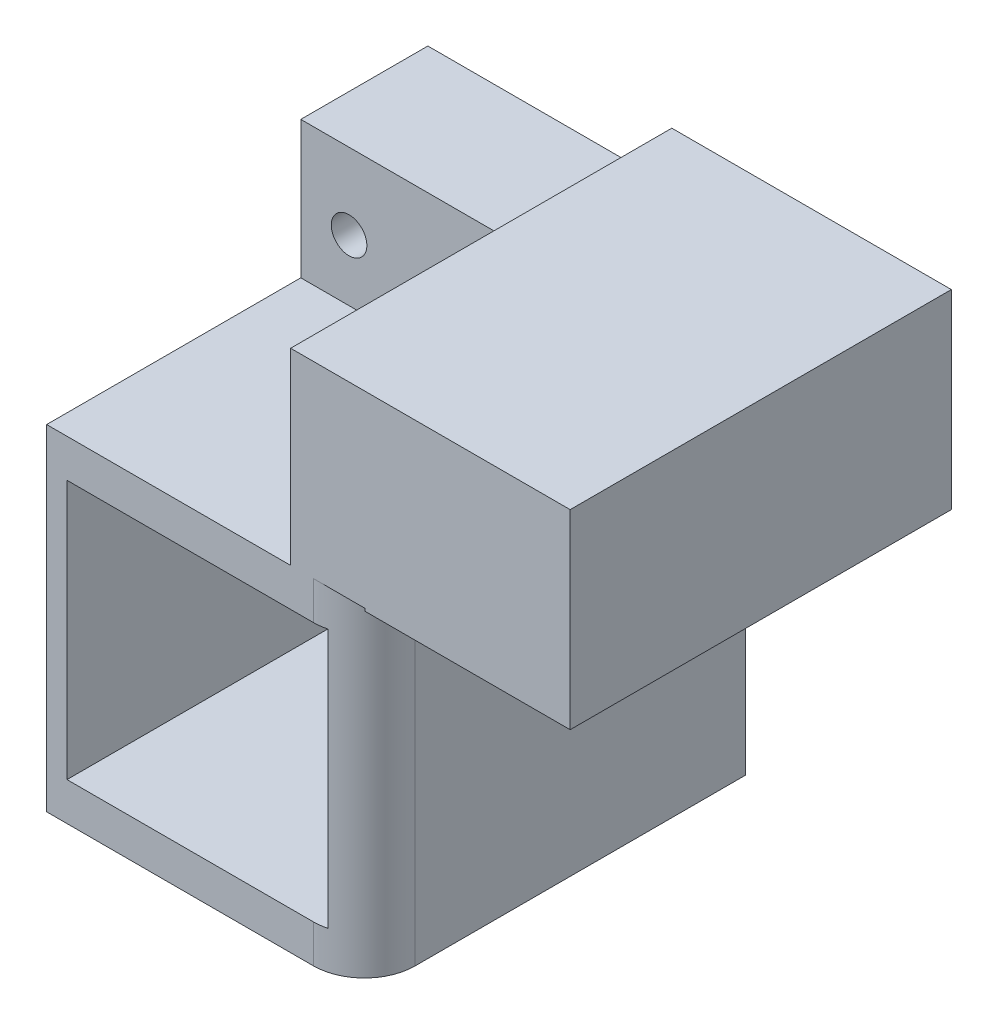
ISO-10303-21;
HEADER;
FILE_DESCRIPTION(('STEP AP214'),'2;1');
FILE_NAME('part.step','',(''),(''),'','','');
FILE_SCHEMA(('AUTOMOTIVE_DESIGN { 1 0 10303 214 1 1 1 1 }'));
ENDSEC;
DATA;
#1=APPLICATION_CONTEXT('core data for automotive mechanical design processes');
#2=APPLICATION_PROTOCOL_DEFINITION('international standard','automotive_design',2000,#1);
#3=PRODUCT_CONTEXT('',#1,'mechanical');
#4=PRODUCT('Part','Part','',(#3));
#5=PRODUCT_RELATED_PRODUCT_CATEGORY('part','',(#4));
#6=PRODUCT_DEFINITION_FORMATION('','',#4);
#7=PRODUCT_DEFINITION_CONTEXT('part definition',#1,'design');
#8=PRODUCT_DEFINITION('design','',#6,#7);
#9=PRODUCT_DEFINITION_SHAPE('','',#8);
#10=(LENGTH_UNIT() NAMED_UNIT(*) SI_UNIT(.MILLI.,.METRE.));
#11=(NAMED_UNIT(*) PLANE_ANGLE_UNIT() SI_UNIT($,.RADIAN.));
#12=(NAMED_UNIT(*) SI_UNIT($,.STERADIAN.) SOLID_ANGLE_UNIT());
#13=UNCERTAINTY_MEASURE_WITH_UNIT(LENGTH_MEASURE(1.E-05),#10,'distance_accuracy_value','');
#14=(GEOMETRIC_REPRESENTATION_CONTEXT(3) GLOBAL_UNCERTAINTY_ASSIGNED_CONTEXT((#13)) GLOBAL_UNIT_ASSIGNED_CONTEXT((#10,
#11,#12)) REPRESENTATION_CONTEXT('',''));
#15=CARTESIAN_POINT('',(0.,0.,0.));
#16=DIRECTION('',(0.,0.,1.));
#17=DIRECTION('',(1.,0.,0.));
#18=AXIS2_PLACEMENT_3D('',#15,#16,#17);
#19=CARTESIAN_POINT('',(-207.4,-33.8,81.));
#20=DIRECTION('',(0.,0.,1.));
#21=DIRECTION('',(1.,0.,0.));
#22=AXIS2_PLACEMENT_3D('',#19,#20,#21);
#23=PLANE('',#22);
#24=DIRECTION('',(0.,-1.,0.));
#25=VECTOR('',#24,1.);
#26=CARTESIAN_POINT('',(-207.4,-33.8,81.));
#27=LINE('',#26,#25);
#28=CARTESIAN_POINT('',(-207.4,-33.8,81.));
#29=VERTEX_POINT('',#28);
#30=CARTESIAN_POINT('',(-207.4,-37.8,81.));
#31=VERTEX_POINT('',#30);
#32=EDGE_CURVE('E504',#29,#31,#27,.T.);
#33=ORIENTED_EDGE('',*,*,#32,.F.);
#34=DIRECTION('',(1.,0.,0.));
#35=VECTOR('',#34,1.);
#36=CARTESIAN_POINT('',(-207.4,-33.8,81.));
#37=LINE('',#36,#35);
#38=CARTESIAN_POINT('',(-197.4,-33.8,81.));
#39=VERTEX_POINT('',#38);
#40=EDGE_CURVE('E429',#29,#39,#37,.T.);
#41=ORIENTED_EDGE('',*,*,#40,.T.);
#42=DIRECTION('',(0.,-1.,0.));
#43=VECTOR('',#42,1.);
#44=CARTESIAN_POINT('',(-197.4,-33.8,81.));
#45=LINE('',#44,#43);
#46=CARTESIAN_POINT('',(-197.4,-37.8,81.));
#47=VERTEX_POINT('',#46);
#48=EDGE_CURVE('E101',#39,#47,#45,.T.);
#49=ORIENTED_EDGE('',*,*,#48,.T.);
#50=DIRECTION('',(1.,0.,0.));
#51=VECTOR('',#50,1.);
#52=CARTESIAN_POINT('',(-210.,-37.8,81.));
#53=LINE('',#52,#51);
#54=EDGE_CURVE('E388',#31,#47,#53,.T.);
#55=ORIENTED_EDGE('',*,*,#54,.F.);
#56=EDGE_LOOP('',(#33,#41,#49,#55));
#57=FACE_BOUND('',#56,.T.);
#58=ADVANCED_FACE('F14',(#57),#23,.F.);
#59=CARTESIAN_POINT('',(-194.4,-30.,73.49));
#60=DIRECTION('',(0.,0.,1.));
#61=DIRECTION('',(1.,0.,0.));
#62=AXIS2_PLACEMENT_3D('',#59,#60,#61);
#63=PLANE('',#62);
#64=CARTESIAN_POINT('',(-194.4,-30.,73.49));
#65=DIRECTION('',(0.,0.,-1.));
#66=DIRECTION('',(1.,0.,0.));
#67=AXIS2_PLACEMENT_3D('',#64,#65,#66);
#68=CIRCLE('',#67,1.4);
#69=CARTESIAN_POINT('',(-193.,-30.,73.49));
#70=VERTEX_POINT('',#69);
#71=EDGE_CURVE('E482',#70,#70,#68,.T.);
#72=ORIENTED_EDGE('',*,*,#71,.F.);
#73=EDGE_LOOP('',(#72));
#74=FACE_BOUND('',#73,.T.);
#75=CARTESIAN_POINT('',(-194.4,-30.,73.49));
#76=DIRECTION('',(0.,0.,-1.));
#77=DIRECTION('',(1.,0.,0.));
#78=AXIS2_PLACEMENT_3D('',#75,#76,#77);
#79=CIRCLE('',#78,1.9);
#80=CARTESIAN_POINT('',(-192.5,-30.,73.49));
#81=VERTEX_POINT('',#80);
#82=EDGE_CURVE('E421',#81,#81,#79,.T.);
#83=ORIENTED_EDGE('',*,*,#82,.T.);
#84=EDGE_LOOP('',(#83));
#85=FACE_BOUND('',#84,.T.);
#86=ADVANCED_FACE('F914',(#74,#85),#63,.F.);
#87=CARTESIAN_POINT('',(-210.4,-30.,73.49));
#88=DIRECTION('',(0.,0.,1.));
#89=DIRECTION('',(1.,0.,0.));
#90=AXIS2_PLACEMENT_3D('',#87,#88,#89);
#91=PLANE('',#90);
#92=CARTESIAN_POINT('',(-210.4,-30.,73.49));
#93=DIRECTION('',(0.,0.,-1.));
#94=DIRECTION('',(1.,0.,0.));
#95=AXIS2_PLACEMENT_3D('',#92,#93,#94);
#96=CIRCLE('',#95,1.4);
#97=CARTESIAN_POINT('',(-209.,-30.,73.49));
#98=VERTEX_POINT('',#97);
#99=EDGE_CURVE('E25',#98,#98,#96,.T.);
#100=ORIENTED_EDGE('',*,*,#99,.F.);
#101=EDGE_LOOP('',(#100));
#102=FACE_BOUND('',#101,.T.);
#103=CARTESIAN_POINT('',(-210.4,-30.,73.49));
#104=DIRECTION('',(0.,0.,-1.));
#105=DIRECTION('',(1.,0.,0.));
#106=AXIS2_PLACEMENT_3D('',#103,#104,#105);
#107=CIRCLE('',#106,1.9);
#108=CARTESIAN_POINT('',(-208.5,-30.,73.49));
#109=VERTEX_POINT('',#108);
#110=EDGE_CURVE('E452',#109,#109,#107,.T.);
#111=ORIENTED_EDGE('',*,*,#110,.T.);
#112=EDGE_LOOP('',(#111));
#113=FACE_BOUND('',#112,.T.);
#114=ADVANCED_FACE('F819',(#102,#113),#91,.F.);
#115=CARTESIAN_POINT('',(-189.15,-61.2,99.));
#116=DIRECTION('',(0.,0.,-1.));
#117=DIRECTION('',(0.,-1.,0.));
#118=AXIS2_PLACEMENT_3D('',#115,#116,#117);
#119=PLANE('',#118);
#120=DIRECTION('',(-1.,0.,0.));
#121=VECTOR('',#120,1.);
#122=CARTESIAN_POINT('',(-192.075,-35.,99.));
#123=LINE('',#122,#121);
#124=CARTESIAN_POINT('',(-189.15,-35.,99.));
#125=VERTEX_POINT('',#124);
#126=CARTESIAN_POINT('',(-189.2,-35.,99.));
#127=VERTEX_POINT('',#126);
#128=EDGE_CURVE('E527',#125,#127,#123,.T.);
#129=ORIENTED_EDGE('',*,*,#128,.F.);
#130=DIRECTION('',(0.,1.,0.));
#131=VECTOR('',#130,1.);
#132=CARTESIAN_POINT('',(-189.15,-61.2,99.));
#133=LINE('',#132,#131);
#134=CARTESIAN_POINT('',(-189.15,-34.8,99.));
#135=VERTEX_POINT('',#134);
#136=EDGE_CURVE('E435',#125,#135,#133,.T.);
#137=ORIENTED_EDGE('',*,*,#136,.T.);
#138=DIRECTION('',(-1.,0.,0.));
#139=VECTOR('',#138,1.);
#140=CARTESIAN_POINT('',(-189.15,-34.8,99.));
#141=LINE('',#140,#139);
#142=CARTESIAN_POINT('',(-189.2,-34.8,99.));
#143=VERTEX_POINT('',#142);
#144=EDGE_CURVE('E445',#135,#143,#141,.T.);
#145=ORIENTED_EDGE('',*,*,#144,.T.);
#146=DIRECTION('',(0.,1.,0.));
#147=VECTOR('',#146,1.);
#148=CARTESIAN_POINT('',(-189.2,-62.2,99.));
#149=LINE('',#148,#147);
#150=EDGE_CURVE('E564',#127,#143,#149,.T.);
#151=ORIENTED_EDGE('',*,*,#150,.F.);
#152=EDGE_LOOP('',(#129,#137,#145,#151));
#153=FACE_BOUND('',#152,.T.);
#154=ADVANCED_FACE('F813',(#153),#119,.F.);
#155=CARTESIAN_POINT('',(-194.4,-30.,83.01));
#156=DIRECTION('',(0.,0.,1.));
#157=DIRECTION('',(1.,0.,0.));
#158=AXIS2_PLACEMENT_3D('',#155,#156,#157);
#159=PLANE('',#158);
#160=CARTESIAN_POINT('',(-194.4,-30.,83.01));
#161=DIRECTION('',(0.,0.,-1.));
#162=DIRECTION('',(1.,0.,0.));
#163=AXIS2_PLACEMENT_3D('',#160,#161,#162);
#164=CIRCLE('',#163,1.4);
#165=CARTESIAN_POINT('',(-195.,-28.73508893593,83.01));
#166=VERTEX_POINT('',#165);
#167=CARTESIAN_POINT('',(-193.,-30.,83.01));
#168=VERTEX_POINT('',#167);
#169=EDGE_CURVE('E481',#166,#168,#164,.T.);
#170=ORIENTED_EDGE('',*,*,#169,.T.);
#171=CARTESIAN_POINT('',(-194.4,-30.,83.01));
#172=DIRECTION('',(0.,0.,-1.));
#173=DIRECTION('',(1.,0.,0.));
#174=AXIS2_PLACEMENT_3D('',#171,#172,#173);
#175=CIRCLE('',#174,1.4);
#176=CARTESIAN_POINT('',(-195.,-31.26491106406,83.01));
#177=VERTEX_POINT('',#176);
#178=EDGE_CURVE('E434',#168,#177,#175,.T.);
#179=ORIENTED_EDGE('',*,*,#178,.T.);
#180=DIRECTION('',(0.,1.,0.));
#181=VECTOR('',#180,1.);
#182=CARTESIAN_POINT('',(-195.,-25.,83.01));
#183=LINE('',#182,#181);
#184=EDGE_CURVE('E386',#177,#166,#183,.T.);
#185=ORIENTED_EDGE('',*,*,#184,.T.);
#186=EDGE_LOOP('',(#170,#179,#185));
#187=FACE_BOUND('',#186,.T.);
#188=ADVANCED_FACE('F818',(#187),#159,.F.);
#189=CARTESIAN_POINT('',(-210.4,-30.,72.99));
#190=DIRECTION('',(0.,0.,1.));
#191=DIRECTION('',(1.,0.,0.));
#192=AXIS2_PLACEMENT_3D('',#189,#190,#191);
#193=CYLINDRICAL_SURFACE('',#192,1.4);
#194=ORIENTED_EDGE('',*,*,#99,.T.);
#195=DIRECTION('',(0.,0.,1.));
#196=VECTOR('',#195,1.);
#197=CARTESIAN_POINT('',(-209.,-30.,72.99));
#198=LINE('',#197,#196);
#199=CARTESIAN_POINT('',(-209.,-30.,83.));
#200=VERTEX_POINT('',#199);
#201=EDGE_CURVE('E9',#98,#200,#198,.T.);
#202=ORIENTED_EDGE('',*,*,#201,.T.);
#203=CARTESIAN_POINT('',(-210.4,-30.,83.));
#204=DIRECTION('',(0.,0.,-1.));
#205=DIRECTION('',(1.,0.,0.));
#206=AXIS2_PLACEMENT_3D('',#203,#204,#205);
#207=CIRCLE('',#206,1.4);
#208=EDGE_CURVE('E376',#200,#200,#207,.T.);
#209=ORIENTED_EDGE('',*,*,#208,.F.);
#210=ORIENTED_EDGE('',*,*,#201,.F.);
#211=EDGE_LOOP('',(#194,#202,#209,#210));
#212=FACE_BOUND('',#211,.T.);
#213=ADVANCED_FACE('F834',(#212),#193,.F.);
#214=CARTESIAN_POINT('',(-194.4,-30.,72.99));
#215=DIRECTION('',(0.,0.,1.));
#216=DIRECTION('',(1.,0.,0.));
#217=AXIS2_PLACEMENT_3D('',#214,#215,#216);
#218=CYLINDRICAL_SURFACE('',#217,1.4);
#219=ORIENTED_EDGE('',*,*,#71,.T.);
#220=DIRECTION('',(0.,0.,1.));
#221=VECTOR('',#220,1.);
#222=CARTESIAN_POINT('',(-193.,-30.,72.99));
#223=LINE('',#222,#221);
#224=EDGE_CURVE('E477',#70,#168,#223,.T.);
#225=ORIENTED_EDGE('',*,*,#224,.T.);
#226=ORIENTED_EDGE('',*,*,#169,.F.);
#227=DIRECTION('',(0.,0.,1.));
#228=VECTOR('',#227,1.);
#229=CARTESIAN_POINT('',(-195.,-28.73508893593,72.99));
#230=LINE('',#229,#228);
#231=CARTESIAN_POINT('',(-195.,-28.73508893593,83.));
#232=VERTEX_POINT('',#231);
#233=EDGE_CURVE('E382',#232,#166,#230,.T.);
#234=ORIENTED_EDGE('',*,*,#233,.F.);
#235=CARTESIAN_POINT('',(-194.4,-30.,83.));
#236=DIRECTION('',(0.,0.,-1.));
#237=DIRECTION('',(1.,0.,0.));
#238=AXIS2_PLACEMENT_3D('',#235,#236,#237);
#239=CIRCLE('',#238,1.4);
#240=CARTESIAN_POINT('',(-195.,-31.26491106407,83.));
#241=VERTEX_POINT('',#240);
#242=EDGE_CURVE('E457',#241,#232,#239,.T.);
#243=ORIENTED_EDGE('',*,*,#242,.F.);
#244=DIRECTION('',(0.,0.,1.));
#245=VECTOR('',#244,1.);
#246=CARTESIAN_POINT('',(-195.,-31.26491106406,72.99));
#247=LINE('',#246,#245);
#248=EDGE_CURVE('E615',#241,#177,#247,.T.);
#249=ORIENTED_EDGE('',*,*,#248,.T.);
#250=ORIENTED_EDGE('',*,*,#178,.F.);
#251=ORIENTED_EDGE('',*,*,#224,.F.);
#252=EDGE_LOOP('',(#219,#225,#226,#234,#243,#249,#250,#251));
#253=FACE_BOUND('',#252,.T.);
#254=ADVANCED_FACE('F828',(#253),#218,.F.);
#255=CARTESIAN_POINT('',(-202.4,-33.8,88.));
#256=DIRECTION('',(0.,-1.,0.));
#257=DIRECTION('',(1.,0.,0.));
#258=AXIS2_PLACEMENT_3D('',#255,#256,#257);
#259=CYLINDRICAL_SURFACE('',#258,1.7);
#260=CARTESIAN_POINT('',(-202.4,-37.8,88.));
#261=DIRECTION('',(0.,1.,0.));
#262=DIRECTION('',(1.,0.,0.));
#263=AXIS2_PLACEMENT_3D('',#260,#261,#262);
#264=CIRCLE('',#263,1.7);
#265=CARTESIAN_POINT('',(-200.7,-37.8,88.));
#266=VERTEX_POINT('',#265);
#267=EDGE_CURVE('E476',#266,#266,#264,.T.);
#268=ORIENTED_EDGE('',*,*,#267,.F.);
#269=DIRECTION('',(0.,-1.,0.));
#270=VECTOR('',#269,1.);
#271=CARTESIAN_POINT('',(-200.7,-33.8,88.));
#272=LINE('',#271,#270);
#273=CARTESIAN_POINT('',(-200.7,-34.8,88.));
#274=VERTEX_POINT('',#273);
#275=EDGE_CURVE('E18',#274,#266,#272,.T.);
#276=ORIENTED_EDGE('',*,*,#275,.F.);
#277=CARTESIAN_POINT('',(-202.4,-34.8,88.));
#278=DIRECTION('',(0.,1.,0.));
#279=DIRECTION('',(1.,0.,0.));
#280=AXIS2_PLACEMENT_3D('',#277,#278,#279);
#281=CIRCLE('',#280,1.7);
#282=EDGE_CURVE('E493',#274,#274,#281,.T.);
#283=ORIENTED_EDGE('',*,*,#282,.T.);
#284=ORIENTED_EDGE('',*,*,#275,.T.);
#285=EDGE_LOOP('',(#268,#276,#283,#284));
#286=FACE_BOUND('',#285,.T.);
#287=ADVANCED_FACE('F833',(#286),#259,.F.);
#288=CARTESIAN_POINT('',(-189.15,-61.2,103.05));
#289=DIRECTION('',(-1.,0.,0.));
#290=DIRECTION('',(0.,0.,1.));
#291=AXIS2_PLACEMENT_3D('',#288,#289,#290);
#292=PLANE('',#291);
#293=ORIENTED_EDGE('',*,*,#136,.F.);
#294=DIRECTION('',(0.,0.,1.));
#295=VECTOR('',#294,1.);
#296=CARTESIAN_POINT('',(-189.15,-35.,88.025));
#297=LINE('',#296,#295);
#298=CARTESIAN_POINT('',(-189.15,-35.,103.));
#299=VERTEX_POINT('',#298);
#300=EDGE_CURVE('E268',#125,#299,#297,.T.);
#301=ORIENTED_EDGE('',*,*,#300,.T.);
#302=DIRECTION('',(0.,1.,0.));
#303=VECTOR('',#302,1.);
#304=CARTESIAN_POINT('',(-189.15,-48.,103.));
#305=LINE('',#304,#303);
#306=CARTESIAN_POINT('',(-189.15,-34.8,103.));
#307=VERTEX_POINT('',#306);
#308=EDGE_CURVE('E487',#299,#307,#305,.T.);
#309=ORIENTED_EDGE('',*,*,#308,.T.);
#310=DIRECTION('',(0.,0.,-1.));
#311=VECTOR('',#310,1.);
#312=CARTESIAN_POINT('',(-189.15,-34.8,103.05));
#313=LINE('',#312,#311);
#314=EDGE_CURVE('E438',#307,#135,#313,.T.);
#315=ORIENTED_EDGE('',*,*,#314,.T.);
#316=EDGE_LOOP('',(#293,#301,#309,#315));
#317=FACE_BOUND('',#316,.T.);
#318=ADVANCED_FACE('F905',(#317),#292,.T.);
#319=CARTESIAN_POINT('',(-189.15,-34.8,103.05));
#320=DIRECTION('',(0.,1.,0.));
#321=DIRECTION('',(1.,0.,0.));
#322=AXIS2_PLACEMENT_3D('',#319,#320,#321);
#323=PLANE('',#322);
#324=ORIENTED_EDGE('',*,*,#144,.F.);
#325=ORIENTED_EDGE('',*,*,#314,.F.);
#326=DIRECTION('',(1.,0.,0.));
#327=VECTOR('',#326,1.);
#328=CARTESIAN_POINT('',(-201.675,-34.8,103.));
#329=LINE('',#328,#327);
#330=CARTESIAN_POINT('',(-193.2,-34.8,103.));
#331=VERTEX_POINT('',#330);
#332=EDGE_CURVE('E483',#331,#307,#329,.T.);
#333=ORIENTED_EDGE('',*,*,#332,.F.);
#334=CARTESIAN_POINT('',(-193.2,-34.8,99.));
#335=DIRECTION('',(0.,-1.,0.));
#336=DIRECTION('',(-1.,0.,0.));
#337=AXIS2_PLACEMENT_3D('',#334,#335,#336);
#338=CIRCLE('',#337,4.);
#339=EDGE_CURVE('E469',#143,#331,#338,.T.);
#340=ORIENTED_EDGE('',*,*,#339,.F.);
#341=EDGE_LOOP('',(#324,#325,#333,#340));
#342=FACE_BOUND('',#341,.T.);
#343=ADVANCED_FACE('F899',(#342),#323,.F.);
#344=CARTESIAN_POINT('',(-202.4,-33.8,88.));
#345=DIRECTION('',(0.,-1.,0.));
#346=DIRECTION('',(1.,0.,0.));
#347=AXIS2_PLACEMENT_3D('',#344,#345,#346);
#348=CYLINDRICAL_SURFACE('',#347,1.7);
#349=CARTESIAN_POINT('',(-202.4,-61.2,88.));
#350=DIRECTION('',(0.,1.,0.));
#351=DIRECTION('',(1.,0.,0.));
#352=AXIS2_PLACEMENT_3D('',#349,#350,#351);
#353=CIRCLE('',#352,1.7);
#354=CARTESIAN_POINT('',(-200.7,-61.2,88.));
#355=VERTEX_POINT('',#354);
#356=EDGE_CURVE('E403',#355,#355,#353,.T.);
#357=ORIENTED_EDGE('',*,*,#356,.F.);
#358=DIRECTION('',(0.,-1.,0.));
#359=VECTOR('',#358,1.);
#360=CARTESIAN_POINT('',(-200.7,-33.8,88.));
#361=LINE('',#360,#359);
#362=CARTESIAN_POINT('',(-200.7,-58.2,88.));
#363=VERTEX_POINT('',#362);
#364=EDGE_CURVE('E448',#363,#355,#361,.T.);
#365=ORIENTED_EDGE('',*,*,#364,.F.);
#366=CARTESIAN_POINT('',(-202.4,-58.2,88.));
#367=DIRECTION('',(0.,1.,0.));
#368=DIRECTION('',(1.,0.,0.));
#369=AXIS2_PLACEMENT_3D('',#366,#367,#368);
#370=CIRCLE('',#369,1.7);
#371=EDGE_CURVE('E420',#363,#363,#370,.T.);
#372=ORIENTED_EDGE('',*,*,#371,.T.);
#373=ORIENTED_EDGE('',*,*,#364,.T.);
#374=EDGE_LOOP('',(#357,#365,#372,#373));
#375=FACE_BOUND('',#374,.T.);
#376=ADVANCED_FACE('F904',(#375),#348,.F.);
#377=CARTESIAN_POINT('',(-193.2,-62.2,99.));
#378=DIRECTION('',(0.,1.,0.));
#379=DIRECTION('',(-1.,0.,0.));
#380=AXIS2_PLACEMENT_3D('',#377,#378,#379);
#381=CYLINDRICAL_SURFACE('',#380,4.);
#382=ORIENTED_EDGE('',*,*,#150,.T.);
#383=ORIENTED_EDGE('',*,*,#339,.T.);
#384=DIRECTION('',(0.,1.,0.));
#385=VECTOR('',#384,1.);
#386=CARTESIAN_POINT('',(-193.2,-62.2,103.));
#387=LINE('',#386,#385);
#388=CARTESIAN_POINT('',(-193.2,-37.8,103.));
#389=VERTEX_POINT('',#388);
#390=EDGE_CURVE('E488',#389,#331,#387,.T.);
#391=ORIENTED_EDGE('',*,*,#390,.F.);
#392=CARTESIAN_POINT('',(-193.2,-37.8,99.));
#393=DIRECTION('',(0.,-1.,0.));
#394=DIRECTION('',(-1.,0.,0.));
#395=AXIS2_PLACEMENT_3D('',#392,#393,#394);
#396=CIRCLE('',#395,4.);
#397=CARTESIAN_POINT('',(-192.2,-37.8,102.8729833462));
#398=VERTEX_POINT('',#397);
#399=EDGE_CURVE('E363',#398,#389,#396,.T.);
#400=ORIENTED_EDGE('',*,*,#399,.F.);
#401=DIRECTION('',(0.,1.,0.));
#402=VECTOR('',#401,1.);
#403=CARTESIAN_POINT('',(-192.2,-62.2,102.8729833462));
#404=LINE('',#403,#402);
#405=CARTESIAN_POINT('',(-192.2,-58.2,102.8729833462));
#406=VERTEX_POINT('',#405);
#407=EDGE_CURVE('E359',#406,#398,#404,.T.);
#408=ORIENTED_EDGE('',*,*,#407,.F.);
#409=CARTESIAN_POINT('',(-193.2,-58.2,99.));
#410=DIRECTION('',(0.,-1.,0.));
#411=DIRECTION('',(-1.,0.,0.));
#412=AXIS2_PLACEMENT_3D('',#409,#410,#411);
#413=CIRCLE('',#412,4.);
#414=CARTESIAN_POINT('',(-193.2,-58.2,103.));
#415=VERTEX_POINT('',#414);
#416=EDGE_CURVE('E293',#406,#415,#413,.T.);
#417=ORIENTED_EDGE('',*,*,#416,.T.);
#418=DIRECTION('',(0.,1.,0.));
#419=VECTOR('',#418,1.);
#420=CARTESIAN_POINT('',(-193.2,-62.2,103.));
#421=LINE('',#420,#419);
#422=CARTESIAN_POINT('',(-193.2,-61.2,103.));
#423=VERTEX_POINT('',#422);
#424=EDGE_CURVE('E464',#423,#415,#421,.T.);
#425=ORIENTED_EDGE('',*,*,#424,.F.);
#426=CARTESIAN_POINT('',(-193.2,-61.2,99.));
#427=DIRECTION('',(0.,-1.,0.));
#428=DIRECTION('',(-1.,0.,0.));
#429=AXIS2_PLACEMENT_3D('',#426,#427,#428);
#430=CIRCLE('',#429,4.);
#431=CARTESIAN_POINT('',(-189.2,-61.2,99.));
#432=VERTEX_POINT('',#431);
#433=EDGE_CURVE('E327',#432,#423,#430,.T.);
#434=ORIENTED_EDGE('',*,*,#433,.F.);
#435=DIRECTION('',(0.,1.,0.));
#436=VECTOR('',#435,1.);
#437=CARTESIAN_POINT('',(-189.2,-62.2,99.));
#438=LINE('',#437,#436);
#439=EDGE_CURVE('E413',#432,#127,#438,.T.);
#440=ORIENTED_EDGE('',*,*,#439,.T.);
#441=EDGE_LOOP('',(#382,#383,#391,#400,#408,#417,#425,#434,#440));
#442=FACE_BOUND('',#441,.T.);
#443=ADVANCED_FACE('F589',(#442),#381,.T.);
#444=CARTESIAN_POINT('',(-207.4,-33.8,72.99));
#445=DIRECTION('',(1.,0.,0.));
#446=DIRECTION('',(0.,1.,0.));
#447=AXIS2_PLACEMENT_3D('',#444,#445,#446);
#448=PLANE('',#447);
#449=ORIENTED_EDGE('',*,*,#32,.T.);
#450=DIRECTION('',(0.,0.,-1.));
#451=VECTOR('',#450,1.);
#452=CARTESIAN_POINT('',(-207.4,-37.8,72.99));
#453=LINE('',#452,#451);
#454=CARTESIAN_POINT('',(-207.4,-37.8,73.));
#455=VERTEX_POINT('',#454);
#456=EDGE_CURVE('E393',#31,#455,#453,.T.);
#457=ORIENTED_EDGE('',*,*,#456,.T.);
#458=DIRECTION('',(0.,-1.,0.));
#459=VECTOR('',#458,1.);
#460=CARTESIAN_POINT('',(-207.4,-34.3,73.));
#461=LINE('',#460,#459);
#462=CARTESIAN_POINT('',(-207.4,-33.8,73.));
#463=VERTEX_POINT('',#462);
#464=EDGE_CURVE('E523',#463,#455,#461,.T.);
#465=ORIENTED_EDGE('',*,*,#464,.F.);
#466=DIRECTION('',(0.,0.,1.));
#467=VECTOR('',#466,1.);
#468=CARTESIAN_POINT('',(-207.4,-33.8,72.99));
#469=LINE('',#468,#467);
#470=EDGE_CURVE('E206',#463,#29,#469,.T.);
#471=ORIENTED_EDGE('',*,*,#470,.T.);
#472=EDGE_LOOP('',(#449,#457,#465,#471));
#473=FACE_BOUND('',#472,.T.);
#474=ADVANCED_FACE('F16',(#473),#448,.T.);
#475=CARTESIAN_POINT('',(-207.4,-33.8,72.99));
#476=DIRECTION('',(0.,-1.,0.));
#477=DIRECTION('',(0.,0.,-1.));
#478=AXIS2_PLACEMENT_3D('',#475,#476,#477);
#479=PLANE('',#478);
#480=ORIENTED_EDGE('',*,*,#40,.F.);
#481=ORIENTED_EDGE('',*,*,#470,.F.);
#482=DIRECTION('',(-1.,0.,0.));
#483=VECTOR('',#482,1.);
#484=CARTESIAN_POINT('',(-210.8,-33.8,73.));
#485=LINE('',#484,#483);
#486=CARTESIAN_POINT('',(-197.4,-33.8,73.));
#487=VERTEX_POINT('',#486);
#488=EDGE_CURVE('E400',#487,#463,#485,.T.);
#489=ORIENTED_EDGE('',*,*,#488,.F.);
#490=DIRECTION('',(0.,0.,1.));
#491=VECTOR('',#490,1.);
#492=CARTESIAN_POINT('',(-197.4,-33.8,72.99));
#493=LINE('',#492,#491);
#494=EDGE_CURVE('E218',#487,#39,#493,.T.);
#495=ORIENTED_EDGE('',*,*,#494,.T.);
#496=EDGE_LOOP('',(#480,#481,#489,#495));
#497=FACE_BOUND('',#496,.T.);
#498=ADVANCED_FACE('F1024',(#497),#479,.T.);
#499=CARTESIAN_POINT('',(-212.6,-37.8,72.99));
#500=DIRECTION('',(1.,0.,0.));
#501=DIRECTION('',(0.,1.,0.));
#502=AXIS2_PLACEMENT_3D('',#499,#500,#501);
#503=PLANE('',#502);
#504=DIRECTION('',(0.,-1.,0.));
#505=VECTOR('',#504,1.);
#506=CARTESIAN_POINT('',(-212.6,-36.3,103.));
#507=LINE('',#506,#505);
#508=CARTESIAN_POINT('',(-212.6,-37.8,103.));
#509=VERTEX_POINT('',#508);
#510=CARTESIAN_POINT('',(-212.6,-58.2,103.));
#511=VERTEX_POINT('',#510);
#512=EDGE_CURVE('E404',#509,#511,#507,.T.);
#513=ORIENTED_EDGE('',*,*,#512,.T.);
#514=DIRECTION('',(0.,0.,1.));
#515=VECTOR('',#514,1.);
#516=CARTESIAN_POINT('',(-212.6,-58.2,72.99));
#517=LINE('',#516,#515);
#518=CARTESIAN_POINT('',(-212.6,-58.2,73.));
#519=VERTEX_POINT('',#518);
#520=EDGE_CURVE('E281',#519,#511,#517,.T.);
#521=ORIENTED_EDGE('',*,*,#520,.F.);
#522=DIRECTION('',(0.,-1.,0.));
#523=VECTOR('',#522,1.);
#524=CARTESIAN_POINT('',(-212.6,-36.3,73.));
#525=LINE('',#524,#523);
#526=CARTESIAN_POINT('',(-212.6,-37.8,73.));
#527=VERTEX_POINT('',#526);
#528=EDGE_CURVE('E458',#527,#519,#525,.T.);
#529=ORIENTED_EDGE('',*,*,#528,.F.);
#530=DIRECTION('',(0.,0.,1.));
#531=VECTOR('',#530,1.);
#532=CARTESIAN_POINT('',(-212.6,-37.8,72.99));
#533=LINE('',#532,#531);
#534=EDGE_CURVE('E540',#527,#509,#533,.T.);
#535=ORIENTED_EDGE('',*,*,#534,.T.);
#536=EDGE_LOOP('',(#513,#521,#529,#535));
#537=FACE_BOUND('',#536,.T.);
#538=ADVANCED_FACE('F575',(#537),#503,.T.);
#539=CARTESIAN_POINT('',(-197.4,-33.8,72.99));
#540=DIRECTION('',(1.,0.,0.));
#541=DIRECTION('',(0.,1.,0.));
#542=AXIS2_PLACEMENT_3D('',#539,#540,#541);
#543=PLANE('',#542);
#544=ORIENTED_EDGE('',*,*,#494,.F.);
#545=DIRECTION('',(0.,-1.,0.));
#546=VECTOR('',#545,1.);
#547=CARTESIAN_POINT('',(-197.4,-34.3,73.));
#548=LINE('',#547,#546);
#549=CARTESIAN_POINT('',(-197.4,-37.8,73.));
#550=VERTEX_POINT('',#549);
#551=EDGE_CURVE('E374',#487,#550,#548,.T.);
#552=ORIENTED_EDGE('',*,*,#551,.T.);
#553=DIRECTION('',(0.,0.,-1.));
#554=VECTOR('',#553,1.);
#555=CARTESIAN_POINT('',(-197.4,-37.8,72.99));
#556=LINE('',#555,#554);
#557=EDGE_CURVE('E392',#47,#550,#556,.T.);
#558=ORIENTED_EDGE('',*,*,#557,.F.);
#559=ORIENTED_EDGE('',*,*,#48,.F.);
#560=EDGE_LOOP('',(#544,#552,#558,#559));
#561=FACE_BOUND('',#560,.T.);
#562=ADVANCED_FACE('F882',(#561),#543,.F.);
#563=CARTESIAN_POINT('',(-212.6,-58.2,72.99));
#564=DIRECTION('',(0.,-1.,0.));
#565=DIRECTION('',(0.,0.,-1.));
#566=AXIS2_PLACEMENT_3D('',#563,#564,#565);
#567=PLANE('',#566);
#568=ORIENTED_EDGE('',*,*,#371,.F.);
#569=EDGE_LOOP('',(#568));
#570=FACE_BOUND('',#569,.T.);
#571=DIRECTION('',(0.,0.,1.));
#572=VECTOR('',#571,1.);
#573=CARTESIAN_POINT('',(-192.2,-58.2,72.99));
#574=LINE('',#573,#572);
#575=CARTESIAN_POINT('',(-192.2,-58.2,73.));
#576=VERTEX_POINT('',#575);
#577=EDGE_CURVE('E364',#576,#406,#574,.T.);
#578=ORIENTED_EDGE('',*,*,#577,.F.);
#579=DIRECTION('',(-1.,0.,0.));
#580=VECTOR('',#579,1.);
#581=CARTESIAN_POINT('',(-213.4,-58.2,73.));
#582=LINE('',#581,#580);
#583=EDGE_CURVE('E461',#576,#519,#582,.T.);
#584=ORIENTED_EDGE('',*,*,#583,.T.);
#585=ORIENTED_EDGE('',*,*,#520,.T.);
#586=DIRECTION('',(-1.,0.,0.));
#587=VECTOR('',#586,1.);
#588=CARTESIAN_POINT('',(-213.4,-58.2,103.));
#589=LINE('',#588,#587);
#590=EDGE_CURVE('E408',#415,#511,#589,.T.);
#591=ORIENTED_EDGE('',*,*,#590,.F.);
#592=ORIENTED_EDGE('',*,*,#416,.F.);
#593=EDGE_LOOP('',(#578,#584,#585,#591,#592));
#594=FACE_BOUND('',#593,.T.);
#595=ADVANCED_FACE('F587',(#570,#594),#567,.F.);
#596=CARTESIAN_POINT('',(-212.6,-37.8,72.99));
#597=DIRECTION('',(0.,-1.,0.));
#598=DIRECTION('',(0.,0.,-1.));
#599=AXIS2_PLACEMENT_3D('',#596,#597,#598);
#600=PLANE('',#599);
#601=ORIENTED_EDGE('',*,*,#267,.T.);
#602=EDGE_LOOP('',(#601));
#603=FACE_BOUND('',#602,.T.);
#604=ORIENTED_EDGE('',*,*,#399,.T.);
#605=DIRECTION('',(-1.,0.,0.));
#606=VECTOR('',#605,1.);
#607=CARTESIAN_POINT('',(-213.4,-37.8,103.));
#608=LINE('',#607,#606);
#609=EDGE_CURVE('E407',#389,#509,#608,.T.);
#610=ORIENTED_EDGE('',*,*,#609,.T.);
#611=ORIENTED_EDGE('',*,*,#534,.F.);
#612=DIRECTION('',(-1.,0.,0.));
#613=VECTOR('',#612,1.);
#614=CARTESIAN_POINT('',(-213.4,-37.8,73.));
#615=LINE('',#614,#613);
#616=EDGE_CURVE('E462',#455,#527,#615,.T.);
#617=ORIENTED_EDGE('',*,*,#616,.F.);
#618=ORIENTED_EDGE('',*,*,#456,.F.);
#619=ORIENTED_EDGE('',*,*,#54,.T.);
#620=ORIENTED_EDGE('',*,*,#557,.T.);
#621=DIRECTION('',(-1.,0.,0.));
#622=VECTOR('',#621,1.);
#623=CARTESIAN_POINT('',(-213.4,-37.8,73.));
#624=LINE('',#623,#622);
#625=CARTESIAN_POINT('',(-192.2,-37.8,73.));
#626=VERTEX_POINT('',#625);
#627=EDGE_CURVE('E370',#626,#550,#624,.T.);
#628=ORIENTED_EDGE('',*,*,#627,.F.);
#629=DIRECTION('',(0.,0.,1.));
#630=VECTOR('',#629,1.);
#631=CARTESIAN_POINT('',(-192.2,-37.8,72.99));
#632=LINE('',#631,#630);
#633=EDGE_CURVE('E357',#626,#398,#632,.T.);
#634=ORIENTED_EDGE('',*,*,#633,.T.);
#635=EDGE_LOOP('',(#604,#610,#611,#617,#618,#619,#620,#628,#634));
#636=FACE_BOUND('',#635,.T.);
#637=ADVANCED_FACE('F581',(#603,#636),#600,.T.);
#638=CARTESIAN_POINT('',(-192.2,-37.8,72.99));
#639=DIRECTION('',(1.,0.,0.));
#640=DIRECTION('',(0.,1.,0.));
#641=AXIS2_PLACEMENT_3D('',#638,#639,#640);
#642=PLANE('',#641);
#643=ORIENTED_EDGE('',*,*,#633,.F.);
#644=DIRECTION('',(0.,-1.,0.));
#645=VECTOR('',#644,1.);
#646=CARTESIAN_POINT('',(-192.2,-36.3,73.));
#647=LINE('',#646,#645);
#648=EDGE_CURVE('E375',#626,#576,#647,.T.);
#649=ORIENTED_EDGE('',*,*,#648,.T.);
#650=ORIENTED_EDGE('',*,*,#577,.T.);
#651=ORIENTED_EDGE('',*,*,#407,.T.);
#652=EDGE_LOOP('',(#643,#649,#650,#651));
#653=FACE_BOUND('',#652,.T.);
#654=ADVANCED_FACE('F591',(#653),#642,.F.);
#655=CARTESIAN_POINT('',(-194.4,-30.,72.99));
#656=DIRECTION('',(0.,0.,1.));
#657=DIRECTION('',(1.,0.,0.));
#658=AXIS2_PLACEMENT_3D('',#655,#656,#657);
#659=CONICAL_SURFACE('',#658,1.4,0.785398163397);
#660=DIRECTION('',(0.707106781186548,0.,0.707106781186548));
#661=VECTOR('',#660,1.);
#662=CARTESIAN_POINT('',(-193.,-30.,72.99));
#663=LINE('',#662,#661);
#664=CARTESIAN_POINT('',(-192.99,-30.,73.));
#665=VERTEX_POINT('',#664);
#666=EDGE_CURVE('E425',#665,#81,#663,.T.);
#667=ORIENTED_EDGE('',*,*,#666,.T.);
#668=ORIENTED_EDGE('',*,*,#82,.F.);
#669=ORIENTED_EDGE('',*,*,#666,.F.);
#670=CARTESIAN_POINT('',(-194.4,-30.,73.));
#671=DIRECTION('',(0.,0.,-1.));
#672=DIRECTION('',(1.,0.,0.));
#673=AXIS2_PLACEMENT_3D('',#670,#671,#672);
#674=CIRCLE('',#673,1.41);
#675=EDGE_CURVE('E412',#665,#665,#674,.T.);
#676=ORIENTED_EDGE('',*,*,#675,.T.);
#677=EDGE_LOOP('',(#667,#668,#669,#676));
#678=FACE_BOUND('',#677,.T.);
#679=ADVANCED_FACE('F944',(#678),#659,.F.);
#680=CARTESIAN_POINT('',(-210.4,-30.,72.99));
#681=DIRECTION('',(0.,0.,1.));
#682=DIRECTION('',(1.,0.,0.));
#683=AXIS2_PLACEMENT_3D('',#680,#681,#682);
#684=CONICAL_SURFACE('',#683,1.4,0.785398163397);
#685=DIRECTION('',(0.707106781186548,0.,0.707106781186548));
#686=VECTOR('',#685,1.);
#687=CARTESIAN_POINT('',(-209.,-30.,72.99));
#688=LINE('',#687,#686);
#689=CARTESIAN_POINT('',(-208.99,-30.,73.));
#690=VERTEX_POINT('',#689);
#691=EDGE_CURVE('E499',#690,#109,#688,.T.);
#692=ORIENTED_EDGE('',*,*,#691,.T.);
#693=ORIENTED_EDGE('',*,*,#110,.F.);
#694=ORIENTED_EDGE('',*,*,#691,.F.);
#695=CARTESIAN_POINT('',(-210.4,-30.,73.));
#696=DIRECTION('',(0.,0.,-1.));
#697=DIRECTION('',(1.,0.,0.));
#698=AXIS2_PLACEMENT_3D('',#695,#696,#697);
#699=CIRCLE('',#698,1.41);
#700=EDGE_CURVE('E368',#690,#690,#699,.T.);
#701=ORIENTED_EDGE('',*,*,#700,.T.);
#702=EDGE_LOOP('',(#692,#693,#694,#701));
#703=FACE_BOUND('',#702,.T.);
#704=ADVANCED_FACE('F938',(#703),#684,.F.);
#705=CARTESIAN_POINT('',(-173.,-20.,73.));
#706=DIRECTION('',(1.,0.,0.));
#707=DIRECTION('',(0.,1.,0.));
#708=AXIS2_PLACEMENT_3D('',#705,#706,#707);
#709=PLANE('',#708);
#710=DIRECTION('',(0.,-1.,0.));
#711=VECTOR('',#710,1.);
#712=CARTESIAN_POINT('',(-173.,-20.,103.));
#713=LINE('',#712,#711);
#714=CARTESIAN_POINT('',(-173.,-20.,103.));
#715=VERTEX_POINT('',#714);
#716=CARTESIAN_POINT('',(-173.,-35.,103.));
#717=VERTEX_POINT('',#716);
#718=EDGE_CURVE('E444',#715,#717,#713,.T.);
#719=ORIENTED_EDGE('',*,*,#718,.T.);
#720=DIRECTION('',(0.,0.,1.));
#721=VECTOR('',#720,1.);
#722=CARTESIAN_POINT('',(-173.,-35.,73.));
#723=LINE('',#722,#721);
#724=CARTESIAN_POINT('',(-173.,-35.,73.));
#725=VERTEX_POINT('',#724);
#726=EDGE_CURVE('E258',#725,#717,#723,.T.);
#727=ORIENTED_EDGE('',*,*,#726,.F.);
#728=DIRECTION('',(0.,-1.,0.));
#729=VECTOR('',#728,1.);
#730=CARTESIAN_POINT('',(-173.,-20.,73.));
#731=LINE('',#730,#729);
#732=CARTESIAN_POINT('',(-173.,-20.,73.));
#733=VERTEX_POINT('',#732);
#734=EDGE_CURVE('E428',#733,#725,#731,.T.);
#735=ORIENTED_EDGE('',*,*,#734,.F.);
#736=DIRECTION('',(0.,0.,1.));
#737=VECTOR('',#736,1.);
#738=CARTESIAN_POINT('',(-173.,-20.,73.));
#739=LINE('',#738,#737);
#740=EDGE_CURVE('E531',#733,#715,#739,.T.);
#741=ORIENTED_EDGE('',*,*,#740,.T.);
#742=EDGE_LOOP('',(#719,#727,#735,#741));
#743=FACE_BOUND('',#742,.T.);
#744=ADVANCED_FACE('F943',(#743),#709,.T.);
#745=CARTESIAN_POINT('',(-195.,-20.,73.));
#746=DIRECTION('',(0.,-1.,0.));
#747=DIRECTION('',(0.,0.,-1.));
#748=AXIS2_PLACEMENT_3D('',#745,#746,#747);
#749=PLANE('',#748);
#750=DIRECTION('',(1.,0.,0.));
#751=VECTOR('',#750,1.);
#752=CARTESIAN_POINT('',(-195.,-20.,73.));
#753=LINE('',#752,#751);
#754=CARTESIAN_POINT('',(-195.,-20.,73.));
#755=VERTEX_POINT('',#754);
#756=EDGE_CURVE('E511',#755,#733,#753,.T.);
#757=ORIENTED_EDGE('',*,*,#756,.F.);
#758=DIRECTION('',(0.,0.,1.));
#759=VECTOR('',#758,1.);
#760=CARTESIAN_POINT('',(-195.,-20.,73.));
#761=LINE('',#760,#759);
#762=CARTESIAN_POINT('',(-195.,-20.,103.));
#763=VERTEX_POINT('',#762);
#764=EDGE_CURVE('E387',#755,#763,#761,.T.);
#765=ORIENTED_EDGE('',*,*,#764,.T.);
#766=DIRECTION('',(1.,0.,0.));
#767=VECTOR('',#766,1.);
#768=CARTESIAN_POINT('',(-195.,-20.,103.));
#769=LINE('',#768,#767);
#770=EDGE_CURVE('E439',#763,#715,#769,.T.);
#771=ORIENTED_EDGE('',*,*,#770,.T.);
#772=ORIENTED_EDGE('',*,*,#740,.F.);
#773=EDGE_LOOP('',(#757,#765,#771,#772));
#774=FACE_BOUND('',#773,.T.);
#775=ADVANCED_FACE('F804',(#774),#749,.F.);
#776=CARTESIAN_POINT('',(-195.,-35.,73.));
#777=DIRECTION('',(0.,-1.,0.));
#778=DIRECTION('',(0.,0.,-1.));
#779=AXIS2_PLACEMENT_3D('',#776,#777,#778);
#780=PLANE('',#779);
#781=ORIENTED_EDGE('',*,*,#726,.T.);
#782=DIRECTION('',(1.,0.,0.));
#783=VECTOR('',#782,1.);
#784=CARTESIAN_POINT('',(-195.,-35.,103.));
#785=LINE('',#784,#783);
#786=EDGE_CURVE('E534',#299,#717,#785,.T.);
#787=ORIENTED_EDGE('',*,*,#786,.F.);
#788=ORIENTED_EDGE('',*,*,#300,.F.);
#789=ORIENTED_EDGE('',*,*,#128,.T.);
#790=DIRECTION('',(0.,0.,1.));
#791=VECTOR('',#790,1.);
#792=CARTESIAN_POINT('',(-189.2,-35.,73.));
#793=LINE('',#792,#791);
#794=CARTESIAN_POINT('',(-189.2,-35.,73.));
#795=VERTEX_POINT('',#794);
#796=EDGE_CURVE('E417',#795,#127,#793,.T.);
#797=ORIENTED_EDGE('',*,*,#796,.F.);
#798=DIRECTION('',(1.,0.,0.));
#799=VECTOR('',#798,1.);
#800=CARTESIAN_POINT('',(-195.,-35.,73.));
#801=LINE('',#800,#799);
#802=EDGE_CURVE('E397',#795,#725,#801,.T.);
#803=ORIENTED_EDGE('',*,*,#802,.T.);
#804=EDGE_LOOP('',(#781,#787,#788,#789,#797,#803));
#805=FACE_BOUND('',#804,.T.);
#806=ADVANCED_FACE('F797',(#805),#780,.T.);
#807=CARTESIAN_POINT('',(-195.,-20.,73.));
#808=DIRECTION('',(1.,0.,0.));
#809=DIRECTION('',(0.,1.,0.));
#810=AXIS2_PLACEMENT_3D('',#807,#808,#809);
#811=PLANE('',#810);
#812=DIRECTION('',(0.,-1.,0.));
#813=VECTOR('',#812,1.);
#814=CARTESIAN_POINT('',(-195.,-20.,103.));
#815=LINE('',#814,#813);
#816=CARTESIAN_POINT('',(-195.,-34.8,103.));
#817=VERTEX_POINT('',#816);
#818=EDGE_CURVE('E443',#763,#817,#815,.T.);
#819=ORIENTED_EDGE('',*,*,#818,.F.);
#820=ORIENTED_EDGE('',*,*,#764,.F.);
#821=DIRECTION('',(0.,-1.,0.));
#822=VECTOR('',#821,1.);
#823=CARTESIAN_POINT('',(-195.,-20.,73.));
#824=LINE('',#823,#822);
#825=CARTESIAN_POINT('',(-195.,-24.,73.));
#826=VERTEX_POINT('',#825);
#827=EDGE_CURVE('E472',#755,#826,#824,.T.);
#828=ORIENTED_EDGE('',*,*,#827,.T.);
#829=DIRECTION('',(0.,0.,-1.));
#830=VECTOR('',#829,1.);
#831=CARTESIAN_POINT('',(-195.,-24.,73.));
#832=LINE('',#831,#830);
#833=CARTESIAN_POINT('',(-195.,-24.,83.));
#834=VERTEX_POINT('',#833);
#835=EDGE_CURVE('E380',#834,#826,#832,.T.);
#836=ORIENTED_EDGE('',*,*,#835,.F.);
#837=DIRECTION('',(0.,-1.,0.));
#838=VECTOR('',#837,1.);
#839=CARTESIAN_POINT('',(-195.,-22.,83.));
#840=LINE('',#839,#838);
#841=EDGE_CURVE('E453',#834,#232,#840,.T.);
#842=ORIENTED_EDGE('',*,*,#841,.T.);
#843=ORIENTED_EDGE('',*,*,#233,.T.);
#844=ORIENTED_EDGE('',*,*,#184,.F.);
#845=ORIENTED_EDGE('',*,*,#248,.F.);
#846=DIRECTION('',(0.,-1.,0.));
#847=VECTOR('',#846,1.);
#848=CARTESIAN_POINT('',(-195.,-22.,83.));
#849=LINE('',#848,#847);
#850=CARTESIAN_POINT('',(-195.,-34.8,83.));
#851=VERTEX_POINT('',#850);
#852=EDGE_CURVE('E554',#241,#851,#849,.T.);
#853=ORIENTED_EDGE('',*,*,#852,.T.);
#854=DIRECTION('',(0.,0.,-1.));
#855=VECTOR('',#854,1.);
#856=CARTESIAN_POINT('',(-195.,-34.8,73.));
#857=LINE('',#856,#855);
#858=EDGE_CURVE('E494',#817,#851,#857,.T.);
#859=ORIENTED_EDGE('',*,*,#858,.F.);
#860=EDGE_LOOP('',(#819,#820,#828,#836,#842,#843,#844,#845,#853,#859));
#861=FACE_BOUND('',#860,.T.);
#862=ADVANCED_FACE('F803',(#861),#811,.F.);
#863=CARTESIAN_POINT('',(-189.2,-34.8,73.));
#864=DIRECTION('',(1.,0.,0.));
#865=DIRECTION('',(0.,1.,0.));
#866=AXIS2_PLACEMENT_3D('',#863,#864,#865);
#867=PLANE('',#866);
#868=ORIENTED_EDGE('',*,*,#796,.T.);
#869=ORIENTED_EDGE('',*,*,#439,.F.);
#870=DIRECTION('',(0.,0.,1.));
#871=VECTOR('',#870,1.);
#872=CARTESIAN_POINT('',(-189.2,-61.2,73.));
#873=LINE('',#872,#871);
#874=CARTESIAN_POINT('',(-189.2,-61.2,73.));
#875=VERTEX_POINT('',#874);
#876=EDGE_CURVE('E331',#875,#432,#873,.T.);
#877=ORIENTED_EDGE('',*,*,#876,.F.);
#878=DIRECTION('',(0.,1.,0.));
#879=VECTOR('',#878,1.);
#880=CARTESIAN_POINT('',(-189.2,-61.2,73.));
#881=LINE('',#880,#879);
#882=EDGE_CURVE('E369',#875,#795,#881,.T.);
#883=ORIENTED_EDGE('',*,*,#882,.T.);
#884=EDGE_LOOP('',(#868,#869,#877,#883));
#885=FACE_BOUND('',#884,.T.);
#886=ADVANCED_FACE('F871',(#885),#867,.T.);
#887=CARTESIAN_POINT('',(-214.2,-24.,73.));
#888=DIRECTION('',(0.,-1.,0.));
#889=DIRECTION('',(0.,0.,-1.));
#890=AXIS2_PLACEMENT_3D('',#887,#888,#889);
#891=PLANE('',#890);
#892=DIRECTION('',(1.,0.,0.));
#893=VECTOR('',#892,1.);
#894=CARTESIAN_POINT('',(-214.2,-24.,73.));
#895=LINE('',#894,#893);
#896=CARTESIAN_POINT('',(-214.2,-24.,73.));
#897=VERTEX_POINT('',#896);
#898=EDGE_CURVE('E310',#897,#826,#895,.T.);
#899=ORIENTED_EDGE('',*,*,#898,.F.);
#900=DIRECTION('',(0.,0.,1.));
#901=VECTOR('',#900,1.);
#902=CARTESIAN_POINT('',(-214.2,-24.,73.));
#903=LINE('',#902,#901);
#904=CARTESIAN_POINT('',(-214.2,-24.,83.));
#905=VERTEX_POINT('',#904);
#906=EDGE_CURVE('E473',#897,#905,#903,.T.);
#907=ORIENTED_EDGE('',*,*,#906,.T.);
#908=DIRECTION('',(1.,0.,0.));
#909=VECTOR('',#908,1.);
#910=CARTESIAN_POINT('',(-214.2,-24.,83.));
#911=LINE('',#910,#909);
#912=EDGE_CURVE('E381',#905,#834,#911,.T.);
#913=ORIENTED_EDGE('',*,*,#912,.T.);
#914=ORIENTED_EDGE('',*,*,#835,.T.);
#915=EDGE_LOOP('',(#899,#907,#913,#914));
#916=FACE_BOUND('',#915,.T.);
#917=ADVANCED_FACE('F865',(#916),#891,.F.);
#918=CARTESIAN_POINT('',(-214.2,-24.,83.));
#919=DIRECTION('',(0.,0.,1.));
#920=DIRECTION('',(1.,0.,0.));
#921=AXIS2_PLACEMENT_3D('',#918,#919,#920);
#922=PLANE('',#921);
#923=ORIENTED_EDGE('',*,*,#208,.T.);
#924=EDGE_LOOP('',(#923));
#925=FACE_BOUND('',#924,.T.);
#926=DIRECTION('',(1.,0.,0.));
#927=VECTOR('',#926,1.);
#928=CARTESIAN_POINT('',(-214.2,-34.8,83.));
#929=LINE('',#928,#927);
#930=CARTESIAN_POINT('',(-214.2,-34.8,83.));
#931=VERTEX_POINT('',#930);
#932=EDGE_CURVE('E489',#931,#851,#929,.T.);
#933=ORIENTED_EDGE('',*,*,#932,.T.);
#934=ORIENTED_EDGE('',*,*,#852,.F.);
#935=ORIENTED_EDGE('',*,*,#242,.T.);
#936=ORIENTED_EDGE('',*,*,#841,.F.);
#937=ORIENTED_EDGE('',*,*,#912,.F.);
#938=DIRECTION('',(0.,-1.,0.));
#939=VECTOR('',#938,1.);
#940=CARTESIAN_POINT('',(-214.2,-24.,83.));
#941=LINE('',#940,#939);
#942=EDGE_CURVE('E623',#905,#931,#941,.T.);
#943=ORIENTED_EDGE('',*,*,#942,.T.);
#944=EDGE_LOOP('',(#933,#934,#935,#936,#937,#943));
#945=FACE_BOUND('',#944,.T.);
#946=ADVANCED_FACE('F870',(#925,#945),#922,.T.);
#947=CARTESIAN_POINT('',(-214.2,-34.8,73.));
#948=DIRECTION('',(0.,-1.,0.));
#949=DIRECTION('',(0.,0.,-1.));
#950=AXIS2_PLACEMENT_3D('',#947,#948,#949);
#951=PLANE('',#950);
#952=ORIENTED_EDGE('',*,*,#282,.F.);
#953=EDGE_LOOP('',(#952));
#954=FACE_BOUND('',#953,.T.);
#955=ORIENTED_EDGE('',*,*,#858,.T.);
#956=ORIENTED_EDGE('',*,*,#932,.F.);
#957=DIRECTION('',(0.,0.,1.));
#958=VECTOR('',#957,1.);
#959=CARTESIAN_POINT('',(-214.2,-34.8,73.));
#960=LINE('',#959,#958);
#961=CARTESIAN_POINT('',(-214.2,-34.8,103.));
#962=VERTEX_POINT('',#961);
#963=EDGE_CURVE('E343',#931,#962,#960,.T.);
#964=ORIENTED_EDGE('',*,*,#963,.T.);
#965=DIRECTION('',(1.,0.,0.));
#966=VECTOR('',#965,1.);
#967=CARTESIAN_POINT('',(-214.2,-34.8,103.));
#968=LINE('',#967,#966);
#969=EDGE_CURVE('E338',#962,#817,#968,.T.);
#970=ORIENTED_EDGE('',*,*,#969,.T.);
#971=EDGE_LOOP('',(#955,#956,#964,#970));
#972=FACE_BOUND('',#971,.T.);
#973=ADVANCED_FACE('F926',(#954,#972),#951,.F.);
#974=CARTESIAN_POINT('',(-214.2,-34.8,103.));
#975=DIRECTION('',(0.,0.,1.));
#976=DIRECTION('',(1.,0.,0.));
#977=AXIS2_PLACEMENT_3D('',#974,#975,#976);
#978=PLANE('',#977);
#979=ORIENTED_EDGE('',*,*,#424,.T.);
#980=ORIENTED_EDGE('',*,*,#590,.T.);
#981=ORIENTED_EDGE('',*,*,#512,.F.);
#982=ORIENTED_EDGE('',*,*,#609,.F.);
#983=ORIENTED_EDGE('',*,*,#390,.T.);
#984=ORIENTED_EDGE('',*,*,#332,.T.);
#985=ORIENTED_EDGE('',*,*,#308,.F.);
#986=ORIENTED_EDGE('',*,*,#786,.T.);
#987=ORIENTED_EDGE('',*,*,#718,.F.);
#988=ORIENTED_EDGE('',*,*,#770,.F.);
#989=ORIENTED_EDGE('',*,*,#818,.T.);
#990=ORIENTED_EDGE('',*,*,#969,.F.);
#991=DIRECTION('',(0.,-1.,0.));
#992=VECTOR('',#991,1.);
#993=CARTESIAN_POINT('',(-214.2,-34.8,103.));
#994=LINE('',#993,#992);
#995=CARTESIAN_POINT('',(-214.2,-61.2,103.));
#996=VERTEX_POINT('',#995);
#997=EDGE_CURVE('E334',#962,#996,#994,.T.);
#998=ORIENTED_EDGE('',*,*,#997,.T.);
#999=DIRECTION('',(1.,0.,0.));
#1000=VECTOR('',#999,1.);
#1001=CARTESIAN_POINT('',(-214.2,-61.2,103.));
#1002=LINE('',#1001,#1000);
#1003=EDGE_CURVE('E318',#996,#423,#1002,.T.);
#1004=ORIENTED_EDGE('',*,*,#1003,.T.);
#1005=EDGE_LOOP('',(#979,#980,#981,#982,#983,#984,#985,#986,#987,#988,#989,#990,#998,#1004));
#1006=FACE_BOUND('',#1005,.T.);
#1007=ADVANCED_FACE('F335',(#1006),#978,.T.);
#1008=CARTESIAN_POINT('',(-214.2,-61.2,73.));
#1009=DIRECTION('',(0.,-1.,0.));
#1010=DIRECTION('',(0.,0.,-1.));
#1011=AXIS2_PLACEMENT_3D('',#1008,#1009,#1010);
#1012=PLANE('',#1011);
#1013=ORIENTED_EDGE('',*,*,#356,.T.);
#1014=EDGE_LOOP('',(#1013));
#1015=FACE_BOUND('',#1014,.T.);
#1016=ORIENTED_EDGE('',*,*,#433,.T.);
#1017=ORIENTED_EDGE('',*,*,#1003,.F.);
#1018=DIRECTION('',(0.,0.,1.));
#1019=VECTOR('',#1018,1.);
#1020=CARTESIAN_POINT('',(-214.2,-61.2,73.));
#1021=LINE('',#1020,#1019);
#1022=CARTESIAN_POINT('',(-214.2,-61.2,73.));
#1023=VERTEX_POINT('',#1022);
#1024=EDGE_CURVE('E323',#1023,#996,#1021,.T.);
#1025=ORIENTED_EDGE('',*,*,#1024,.F.);
#1026=DIRECTION('',(1.,0.,0.));
#1027=VECTOR('',#1026,1.);
#1028=CARTESIAN_POINT('',(-214.2,-61.2,73.));
#1029=LINE('',#1028,#1027);
#1030=EDGE_CURVE('E365',#1023,#875,#1029,.T.);
#1031=ORIENTED_EDGE('',*,*,#1030,.T.);
#1032=ORIENTED_EDGE('',*,*,#876,.T.);
#1033=EDGE_LOOP('',(#1016,#1017,#1025,#1031,#1032));
#1034=FACE_BOUND('',#1033,.T.);
#1035=ADVANCED_FACE('F320',(#1015,#1034),#1012,.T.);
#1036=CARTESIAN_POINT('',(-214.2,-34.8,73.));
#1037=DIRECTION('',(0.,0.,1.));
#1038=DIRECTION('',(1.,0.,0.));
#1039=AXIS2_PLACEMENT_3D('',#1036,#1037,#1038);
#1040=PLANE('',#1039);
#1041=ORIENTED_EDGE('',*,*,#648,.F.);
#1042=ORIENTED_EDGE('',*,*,#627,.T.);
#1043=ORIENTED_EDGE('',*,*,#551,.F.);
#1044=ORIENTED_EDGE('',*,*,#488,.T.);
#1045=ORIENTED_EDGE('',*,*,#464,.T.);
#1046=ORIENTED_EDGE('',*,*,#616,.T.);
#1047=ORIENTED_EDGE('',*,*,#528,.T.);
#1048=ORIENTED_EDGE('',*,*,#583,.F.);
#1049=EDGE_LOOP('',(#1041,#1042,#1043,#1044,#1045,#1046,#1047,#1048));
#1050=FACE_BOUND('',#1049,.T.);
#1051=ORIENTED_EDGE('',*,*,#675,.F.);
#1052=EDGE_LOOP('',(#1051));
#1053=FACE_BOUND('',#1052,.T.);
#1054=ORIENTED_EDGE('',*,*,#700,.F.);
#1055=EDGE_LOOP('',(#1054));
#1056=FACE_BOUND('',#1055,.T.);
#1057=DIRECTION('',(0.,1.,0.));
#1058=VECTOR('',#1057,1.);
#1059=CARTESIAN_POINT('',(-214.2,-61.2,73.));
#1060=LINE('',#1059,#1058);
#1061=EDGE_CURVE('E347',#1023,#897,#1060,.T.);
#1062=ORIENTED_EDGE('',*,*,#1061,.T.);
#1063=ORIENTED_EDGE('',*,*,#898,.T.);
#1064=ORIENTED_EDGE('',*,*,#827,.F.);
#1065=ORIENTED_EDGE('',*,*,#756,.T.);
#1066=ORIENTED_EDGE('',*,*,#734,.T.);
#1067=ORIENTED_EDGE('',*,*,#802,.F.);
#1068=ORIENTED_EDGE('',*,*,#882,.F.);
#1069=ORIENTED_EDGE('',*,*,#1030,.F.);
#1070=EDGE_LOOP('',(#1062,#1063,#1064,#1065,#1066,#1067,#1068,#1069));
#1071=FACE_BOUND('',#1070,.T.);
#1072=ADVANCED_FACE('F595',(#1050,#1053,#1056,#1071),#1040,.F.);
#1073=CARTESIAN_POINT('',(-214.2,-34.8,73.));
#1074=DIRECTION('',(1.,0.,0.));
#1075=DIRECTION('',(0.,1.,0.));
#1076=AXIS2_PLACEMENT_3D('',#1073,#1074,#1075);
#1077=PLANE('',#1076);
#1078=ORIENTED_EDGE('',*,*,#1061,.F.);
#1079=ORIENTED_EDGE('',*,*,#1024,.T.);
#1080=ORIENTED_EDGE('',*,*,#997,.F.);
#1081=ORIENTED_EDGE('',*,*,#963,.F.);
#1082=ORIENTED_EDGE('',*,*,#942,.F.);
#1083=ORIENTED_EDGE('',*,*,#906,.F.);
#1084=EDGE_LOOP('',(#1078,#1079,#1080,#1081,#1082,#1083));
#1085=FACE_BOUND('',#1084,.T.);
#1086=ADVANCED_FACE('F345',(#1085),#1077,.F.);
#1087=CLOSED_SHELL('',(#58,#86,#114,#154,#188,#213,#254,#287,#318,#343,#376,#443,#474,#498,#538,
#562,#595,#637,#654,#679,#704,#744,#775,#806,#862,#886,#917,#946,#973,#1007,#1035,#1072,#1086));
#1088=MANIFOLD_SOLID_BREP('B1',#1087);
#1089=ADVANCED_BREP_SHAPE_REPRESENTATION('',(#18,#1088),#14);
#1090=SHAPE_DEFINITION_REPRESENTATION(#9,#1089);
ENDSEC;
END-ISO-10303-21;
